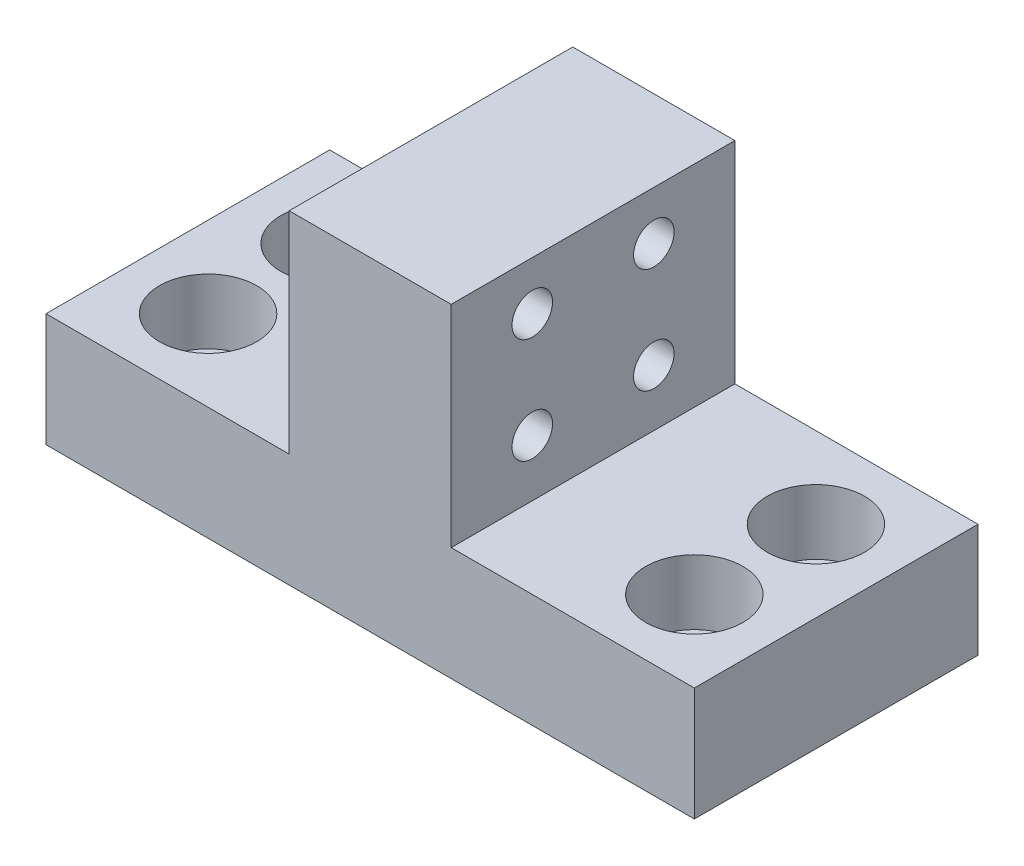
ISO-10303-21;
HEADER;
FILE_DESCRIPTION(('STEP AP214'),'2;1');
FILE_NAME('part.step','',(''),(''),'','','');
FILE_SCHEMA(('AUTOMOTIVE_DESIGN { 1 0 10303 214 1 1 1 1 }'));
ENDSEC;
DATA;
#1=APPLICATION_CONTEXT('core data for automotive mechanical design processes');
#2=APPLICATION_PROTOCOL_DEFINITION('international standard','automotive_design',2000,#1);
#3=PRODUCT_CONTEXT('',#1,'mechanical');
#4=PRODUCT('Part','Part','',(#3));
#5=PRODUCT_RELATED_PRODUCT_CATEGORY('part','',(#4));
#6=PRODUCT_DEFINITION_FORMATION('','',#4);
#7=PRODUCT_DEFINITION_CONTEXT('part definition',#1,'design');
#8=PRODUCT_DEFINITION('design','',#6,#7);
#9=PRODUCT_DEFINITION_SHAPE('','',#8);
#10=(LENGTH_UNIT() NAMED_UNIT(*) SI_UNIT(.MILLI.,.METRE.));
#11=(NAMED_UNIT(*) PLANE_ANGLE_UNIT() SI_UNIT($,.RADIAN.));
#12=(NAMED_UNIT(*) SI_UNIT($,.STERADIAN.) SOLID_ANGLE_UNIT());
#13=UNCERTAINTY_MEASURE_WITH_UNIT(LENGTH_MEASURE(1.E-05),#10,'distance_accuracy_value','');
#14=(GEOMETRIC_REPRESENTATION_CONTEXT(3) GLOBAL_UNCERTAINTY_ASSIGNED_CONTEXT((#13)) GLOBAL_UNIT_ASSIGNED_CONTEXT((#10,
#11,#12)) REPRESENTATION_CONTEXT('',''));
#15=CARTESIAN_POINT('',(0.,0.,0.));
#16=DIRECTION('',(0.,0.,1.));
#17=DIRECTION('',(1.,0.,0.));
#18=AXIS2_PLACEMENT_3D('',#15,#16,#17);
#19=CARTESIAN_POINT('',(40.,34.,7.5));
#20=DIRECTION('',(-1.,0.,0.));
#21=DIRECTION('',(0.,0.,1.));
#22=AXIS2_PLACEMENT_3D('',#19,#20,#21);
#23=CYLINDRICAL_SURFACE('',#22,2.5);
#24=CARTESIAN_POINT('',(-10.,34.,7.5));
#25=DIRECTION('',(-1.,0.,0.));
#26=DIRECTION('',(0.,0.,1.));
#27=AXIS2_PLACEMENT_3D('',#24,#25,#26);
#28=CIRCLE('',#27,2.5);
#29=CARTESIAN_POINT('',(-10.,34.,10.));
#30=VERTEX_POINT('',#29);
#31=EDGE_CURVE('E47',#30,#30,#28,.T.);
#32=ORIENTED_EDGE('',*,*,#31,.T.);
#33=EDGE_LOOP('',(#32));
#34=FACE_BOUND('',#33,.T.);
#35=CARTESIAN_POINT('',(10.,34.,7.5));
#36=DIRECTION('',(-1.,0.,0.));
#37=DIRECTION('',(0.,0.,1.));
#38=AXIS2_PLACEMENT_3D('',#35,#36,#37);
#39=CIRCLE('',#38,2.5);
#40=CARTESIAN_POINT('',(10.,34.,10.));
#41=VERTEX_POINT('',#40);
#42=EDGE_CURVE('E11',#41,#41,#39,.T.);
#43=ORIENTED_EDGE('',*,*,#42,.F.);
#44=EDGE_LOOP('',(#43));
#45=FACE_BOUND('',#44,.T.);
#46=ADVANCED_FACE('F39',(#34,#45),#23,.F.);
#47=CARTESIAN_POINT('',(40.,34.,-7.5));
#48=DIRECTION('',(-1.,0.,0.));
#49=DIRECTION('',(0.,0.,1.));
#50=AXIS2_PLACEMENT_3D('',#47,#48,#49);
#51=CYLINDRICAL_SURFACE('',#50,2.5);
#52=CARTESIAN_POINT('',(-10.,34.,-7.5));
#53=DIRECTION('',(-1.,0.,0.));
#54=DIRECTION('',(0.,0.,1.));
#55=AXIS2_PLACEMENT_3D('',#52,#53,#54);
#56=CIRCLE('',#55,2.5);
#57=CARTESIAN_POINT('',(-10.,34.,-5.));
#58=VERTEX_POINT('',#57);
#59=EDGE_CURVE('E181',#58,#58,#56,.T.);
#60=ORIENTED_EDGE('',*,*,#59,.T.);
#61=EDGE_LOOP('',(#60));
#62=FACE_BOUND('',#61,.T.);
#63=CARTESIAN_POINT('',(10.,34.,-7.5));
#64=DIRECTION('',(-1.,0.,0.));
#65=DIRECTION('',(0.,0.,1.));
#66=AXIS2_PLACEMENT_3D('',#63,#64,#65);
#67=CIRCLE('',#66,2.5);
#68=CARTESIAN_POINT('',(10.,34.,-5.));
#69=VERTEX_POINT('',#68);
#70=EDGE_CURVE('E191',#69,#69,#67,.T.);
#71=ORIENTED_EDGE('',*,*,#70,.F.);
#72=EDGE_LOOP('',(#71));
#73=FACE_BOUND('',#72,.T.);
#74=ADVANCED_FACE('F218',(#62,#73),#51,.F.);
#75=CARTESIAN_POINT('',(0.,14.,0.));
#76=DIRECTION('',(0.,1.,0.));
#77=DIRECTION('',(0.,0.,1.));
#78=AXIS2_PLACEMENT_3D('',#75,#76,#77);
#79=PLANE('',#78);
#80=CARTESIAN_POINT('',(30.,14.,7.5));
#81=DIRECTION('',(0.,1.,0.));
#82=DIRECTION('',(0.,0.,1.));
#83=AXIS2_PLACEMENT_3D('',#80,#81,#82);
#84=CIRCLE('',#83,6.);
#85=CARTESIAN_POINT('',(30.,14.,13.5));
#86=VERTEX_POINT('',#85);
#87=EDGE_CURVE('E186',#86,#86,#84,.T.);
#88=ORIENTED_EDGE('',*,*,#87,.F.);
#89=EDGE_LOOP('',(#88));
#90=FACE_BOUND('',#89,.T.);
#91=CARTESIAN_POINT('',(30.,14.,-7.5));
#92=DIRECTION('',(0.,1.,0.));
#93=DIRECTION('',(0.,0.,1.));
#94=AXIS2_PLACEMENT_3D('',#91,#92,#93);
#95=CIRCLE('',#94,6.);
#96=CARTESIAN_POINT('',(30.,14.,-1.5));
#97=VERTEX_POINT('',#96);
#98=EDGE_CURVE('E328',#97,#97,#95,.T.);
#99=ORIENTED_EDGE('',*,*,#98,.F.);
#100=EDGE_LOOP('',(#99));
#101=FACE_BOUND('',#100,.T.);
#102=DIRECTION('',(0.,0.,-1.));
#103=VECTOR('',#102,1.);
#104=CARTESIAN_POINT('',(10.,14.,17.5));
#105=LINE('',#104,#103);
#106=CARTESIAN_POINT('',(10.,14.,17.5));
#107=VERTEX_POINT('',#106);
#108=CARTESIAN_POINT('',(10.,14.,-17.5));
#109=VERTEX_POINT('',#108);
#110=EDGE_CURVE('E54',#107,#109,#105,.T.);
#111=ORIENTED_EDGE('',*,*,#110,.F.);
#112=DIRECTION('',(1.,0.,0.));
#113=VECTOR('',#112,1.);
#114=CARTESIAN_POINT('',(-40.,14.,17.5));
#115=LINE('',#114,#113);
#116=CARTESIAN_POINT('',(40.,14.,17.5));
#117=VERTEX_POINT('',#116);
#118=EDGE_CURVE('E150',#107,#117,#115,.T.);
#119=ORIENTED_EDGE('',*,*,#118,.T.);
#120=DIRECTION('',(0.,0.,-1.));
#121=VECTOR('',#120,1.);
#122=CARTESIAN_POINT('',(40.,14.,17.5));
#123=LINE('',#122,#121);
#124=CARTESIAN_POINT('',(40.,14.,-17.5));
#125=VERTEX_POINT('',#124);
#126=EDGE_CURVE('E154',#117,#125,#123,.T.);
#127=ORIENTED_EDGE('',*,*,#126,.T.);
#128=DIRECTION('',(-1.,0.,0.));
#129=VECTOR('',#128,1.);
#130=CARTESIAN_POINT('',(40.,14.,-17.5));
#131=LINE('',#130,#129);
#132=EDGE_CURVE('E144',#125,#109,#131,.T.);
#133=ORIENTED_EDGE('',*,*,#132,.T.);
#134=EDGE_LOOP('',(#111,#119,#127,#133));
#135=FACE_BOUND('',#134,.T.);
#136=ADVANCED_FACE('F222',(#90,#101,#135),#79,.T.);
#137=CARTESIAN_POINT('',(40.,14.,-17.5));
#138=DIRECTION('',(0.,0.,1.));
#139=DIRECTION('',(1.,0.,0.));
#140=AXIS2_PLACEMENT_3D('',#137,#138,#139);
#141=PLANE('',#140);
#142=DIRECTION('',(-1.,0.,0.));
#143=VECTOR('',#142,1.);
#144=CARTESIAN_POINT('',(40.,0.,-17.5));
#145=LINE('',#144,#143);
#146=CARTESIAN_POINT('',(40.,0.,-17.5));
#147=VERTEX_POINT('',#146);
#148=CARTESIAN_POINT('',(-40.,0.,-17.5));
#149=VERTEX_POINT('',#148);
#150=EDGE_CURVE('E132',#147,#149,#145,.T.);
#151=ORIENTED_EDGE('',*,*,#150,.T.);
#152=DIRECTION('',(0.,-1.,0.));
#153=VECTOR('',#152,1.);
#154=CARTESIAN_POINT('',(-40.,14.,-17.5));
#155=LINE('',#154,#153);
#156=CARTESIAN_POINT('',(-40.,14.,-17.5));
#157=VERTEX_POINT('',#156);
#158=EDGE_CURVE('E177',#157,#149,#155,.T.);
#159=ORIENTED_EDGE('',*,*,#158,.F.);
#160=CARTESIAN_POINT('',(-10.,14.,-17.5));
#161=VERTEX_POINT('',#160);
#162=EDGE_CURVE('E130',#161,#157,#131,.T.);
#163=ORIENTED_EDGE('',*,*,#162,.F.);
#164=DIRECTION('',(0.,-1.,0.));
#165=VECTOR('',#164,1.);
#166=CARTESIAN_POINT('',(-10.,40.,-17.5));
#167=LINE('',#166,#165);
#168=CARTESIAN_POINT('',(-10.,40.,-17.5));
#169=VERTEX_POINT('',#168);
#170=EDGE_CURVE('E109',#169,#161,#167,.T.);
#171=ORIENTED_EDGE('',*,*,#170,.F.);
#172=DIRECTION('',(-1.,0.,0.));
#173=VECTOR('',#172,1.);
#174=CARTESIAN_POINT('',(10.,40.,-17.5));
#175=LINE('',#174,#173);
#176=CARTESIAN_POINT('',(10.,40.,-17.5));
#177=VERTEX_POINT('',#176);
#178=EDGE_CURVE('E116',#177,#169,#175,.T.);
#179=ORIENTED_EDGE('',*,*,#178,.F.);
#180=DIRECTION('',(0.,-1.,0.));
#181=VECTOR('',#180,1.);
#182=CARTESIAN_POINT('',(10.,40.,-17.5));
#183=LINE('',#182,#181);
#184=EDGE_CURVE('E281',#177,#109,#183,.T.);
#185=ORIENTED_EDGE('',*,*,#184,.T.);
#186=ORIENTED_EDGE('',*,*,#132,.F.);
#187=DIRECTION('',(0.,-1.,0.));
#188=VECTOR('',#187,1.);
#189=CARTESIAN_POINT('',(40.,14.,-17.5));
#190=LINE('',#189,#188);
#191=EDGE_CURVE('E156',#125,#147,#190,.T.);
#192=ORIENTED_EDGE('',*,*,#191,.T.);
#193=EDGE_LOOP('',(#151,#159,#163,#171,#179,#185,#186,#192));
#194=FACE_BOUND('',#193,.T.);
#195=ADVANCED_FACE('F128',(#194),#141,.F.);
#196=CARTESIAN_POINT('',(-40.,14.,-17.5));
#197=DIRECTION('',(1.,0.,0.));
#198=DIRECTION('',(0.,0.,-1.));
#199=AXIS2_PLACEMENT_3D('',#196,#197,#198);
#200=PLANE('',#199);
#201=DIRECTION('',(0.,0.,1.));
#202=VECTOR('',#201,1.);
#203=CARTESIAN_POINT('',(-40.,0.,-17.5));
#204=LINE('',#203,#202);
#205=CARTESIAN_POINT('',(-40.,0.,17.5));
#206=VERTEX_POINT('',#205);
#207=EDGE_CURVE('E137',#149,#206,#204,.T.);
#208=ORIENTED_EDGE('',*,*,#207,.T.);
#209=DIRECTION('',(0.,-1.,0.));
#210=VECTOR('',#209,1.);
#211=CARTESIAN_POINT('',(-40.,14.,17.5));
#212=LINE('',#211,#210);
#213=CARTESIAN_POINT('',(-40.,14.,17.5));
#214=VERTEX_POINT('',#213);
#215=EDGE_CURVE('E173',#214,#206,#212,.T.);
#216=ORIENTED_EDGE('',*,*,#215,.F.);
#217=DIRECTION('',(0.,0.,1.));
#218=VECTOR('',#217,1.);
#219=CARTESIAN_POINT('',(-40.,14.,-17.5));
#220=LINE('',#219,#218);
#221=EDGE_CURVE('E147',#157,#214,#220,.T.);
#222=ORIENTED_EDGE('',*,*,#221,.F.);
#223=ORIENTED_EDGE('',*,*,#158,.T.);
#224=EDGE_LOOP('',(#208,#216,#222,#223));
#225=FACE_BOUND('',#224,.T.);
#226=ADVANCED_FACE('F232',(#225),#200,.F.);
#227=CARTESIAN_POINT('',(-40.,14.,17.5));
#228=DIRECTION('',(0.,0.,-1.));
#229=DIRECTION('',(-1.,0.,0.));
#230=AXIS2_PLACEMENT_3D('',#227,#228,#229);
#231=PLANE('',#230);
#232=DIRECTION('',(1.,0.,0.));
#233=VECTOR('',#232,1.);
#234=CARTESIAN_POINT('',(-40.,0.,17.5));
#235=LINE('',#234,#233);
#236=CARTESIAN_POINT('',(40.,0.,17.5));
#237=VERTEX_POINT('',#236);
#238=EDGE_CURVE('E160',#206,#237,#235,.T.);
#239=ORIENTED_EDGE('',*,*,#238,.T.);
#240=DIRECTION('',(0.,-1.,0.));
#241=VECTOR('',#240,1.);
#242=CARTESIAN_POINT('',(40.,14.,17.5));
#243=LINE('',#242,#241);
#244=EDGE_CURVE('E169',#117,#237,#243,.T.);
#245=ORIENTED_EDGE('',*,*,#244,.F.);
#246=ORIENTED_EDGE('',*,*,#118,.F.);
#247=DIRECTION('',(0.,-1.,0.));
#248=VECTOR('',#247,1.);
#249=CARTESIAN_POINT('',(10.,40.,17.5));
#250=LINE('',#249,#248);
#251=CARTESIAN_POINT('',(10.,40.,17.5));
#252=VERTEX_POINT('',#251);
#253=EDGE_CURVE('E140',#252,#107,#250,.T.);
#254=ORIENTED_EDGE('',*,*,#253,.F.);
#255=DIRECTION('',(1.,0.,0.));
#256=VECTOR('',#255,1.);
#257=CARTESIAN_POINT('',(10.,40.,17.5));
#258=LINE('',#257,#256);
#259=CARTESIAN_POINT('',(-10.,40.,17.5));
#260=VERTEX_POINT('',#259);
#261=EDGE_CURVE('E115',#260,#252,#258,.T.);
#262=ORIENTED_EDGE('',*,*,#261,.F.);
#263=DIRECTION('',(0.,-1.,0.));
#264=VECTOR('',#263,1.);
#265=CARTESIAN_POINT('',(-10.,40.,17.5));
#266=LINE('',#265,#264);
#267=CARTESIAN_POINT('',(-10.,14.,17.5));
#268=VERTEX_POINT('',#267);
#269=EDGE_CURVE('E111',#260,#268,#266,.T.);
#270=ORIENTED_EDGE('',*,*,#269,.T.);
#271=EDGE_CURVE('E151',#214,#268,#115,.T.);
#272=ORIENTED_EDGE('',*,*,#271,.F.);
#273=ORIENTED_EDGE('',*,*,#215,.T.);
#274=EDGE_LOOP('',(#239,#245,#246,#254,#262,#270,#272,#273));
#275=FACE_BOUND('',#274,.T.);
#276=ADVANCED_FACE('F235',(#275),#231,.F.);
#277=CARTESIAN_POINT('',(40.,14.,17.5));
#278=DIRECTION('',(-1.,0.,0.));
#279=DIRECTION('',(0.,0.,1.));
#280=AXIS2_PLACEMENT_3D('',#277,#278,#279);
#281=PLANE('',#280);
#282=DIRECTION('',(0.,0.,-1.));
#283=VECTOR('',#282,1.);
#284=CARTESIAN_POINT('',(40.,0.,17.5));
#285=LINE('',#284,#283);
#286=EDGE_CURVE('E163',#237,#147,#285,.T.);
#287=ORIENTED_EDGE('',*,*,#286,.T.);
#288=ORIENTED_EDGE('',*,*,#191,.F.);
#289=ORIENTED_EDGE('',*,*,#126,.F.);
#290=ORIENTED_EDGE('',*,*,#244,.T.);
#291=EDGE_LOOP('',(#287,#288,#289,#290));
#292=FACE_BOUND('',#291,.T.);
#293=ADVANCED_FACE('F239',(#292),#281,.F.);
#294=CARTESIAN_POINT('',(-30.,14.,7.5));
#295=DIRECTION('',(0.,1.,0.));
#296=DIRECTION('',(0.,0.,1.));
#297=AXIS2_PLACEMENT_3D('',#294,#295,#296);
#298=CIRCLE('',#297,6.);
#299=CARTESIAN_POINT('',(-30.,14.,13.5));
#300=VERTEX_POINT('',#299);
#301=EDGE_CURVE('E250',#300,#300,#298,.T.);
#302=ORIENTED_EDGE('',*,*,#301,.F.);
#303=EDGE_LOOP('',(#302));
#304=FACE_BOUND('',#303,.T.);
#305=CARTESIAN_POINT('',(-30.,14.,-7.5));
#306=DIRECTION('',(0.,1.,0.));
#307=DIRECTION('',(0.,0.,1.));
#308=AXIS2_PLACEMENT_3D('',#305,#306,#307);
#309=CIRCLE('',#308,6.);
#310=CARTESIAN_POINT('',(-30.,14.,-1.5));
#311=VERTEX_POINT('',#310);
#312=EDGE_CURVE('E253',#311,#311,#309,.T.);
#313=ORIENTED_EDGE('',*,*,#312,.F.);
#314=EDGE_LOOP('',(#313));
#315=FACE_BOUND('',#314,.T.);
#316=DIRECTION('',(0.,0.,1.));
#317=VECTOR('',#316,1.);
#318=CARTESIAN_POINT('',(-10.,14.,-17.5));
#319=LINE('',#318,#317);
#320=EDGE_CURVE('E62',#161,#268,#319,.T.);
#321=ORIENTED_EDGE('',*,*,#320,.F.);
#322=ORIENTED_EDGE('',*,*,#162,.T.);
#323=ORIENTED_EDGE('',*,*,#221,.T.);
#324=ORIENTED_EDGE('',*,*,#271,.T.);
#325=EDGE_LOOP('',(#321,#322,#323,#324));
#326=FACE_BOUND('',#325,.T.);
#327=ADVANCED_FACE('F211',(#304,#315,#326),#79,.T.);
#328=CARTESIAN_POINT('',(0.,0.,0.));
#329=DIRECTION('',(0.,1.,0.));
#330=DIRECTION('',(0.,0.,1.));
#331=AXIS2_PLACEMENT_3D('',#328,#329,#330);
#332=PLANE('',#331);
#333=CARTESIAN_POINT('',(30.,0.,7.5));
#334=DIRECTION('',(0.,1.,0.));
#335=DIRECTION('',(0.,0.,1.));
#336=AXIS2_PLACEMENT_3D('',#333,#334,#335);
#337=CIRCLE('',#336,3.5);
#338=CARTESIAN_POINT('',(30.,0.,11.));
#339=VERTEX_POINT('',#338);
#340=EDGE_CURVE('E300',#339,#339,#337,.T.);
#341=ORIENTED_EDGE('',*,*,#340,.T.);
#342=EDGE_LOOP('',(#341));
#343=FACE_BOUND('',#342,.T.);
#344=CARTESIAN_POINT('',(30.,0.,-7.5));
#345=DIRECTION('',(0.,1.,0.));
#346=DIRECTION('',(0.,0.,1.));
#347=AXIS2_PLACEMENT_3D('',#344,#345,#346);
#348=CIRCLE('',#347,3.5);
#349=CARTESIAN_POINT('',(30.,0.,-4.));
#350=VERTEX_POINT('',#349);
#351=EDGE_CURVE('E316',#350,#350,#348,.T.);
#352=ORIENTED_EDGE('',*,*,#351,.T.);
#353=EDGE_LOOP('',(#352));
#354=FACE_BOUND('',#353,.T.);
#355=CARTESIAN_POINT('',(-30.,0.,7.5));
#356=DIRECTION('',(0.,1.,0.));
#357=DIRECTION('',(0.,0.,1.));
#358=AXIS2_PLACEMENT_3D('',#355,#356,#357);
#359=CIRCLE('',#358,3.5);
#360=CARTESIAN_POINT('',(-30.,0.,11.));
#361=VERTEX_POINT('',#360);
#362=EDGE_CURVE('E257',#361,#361,#359,.T.);
#363=ORIENTED_EDGE('',*,*,#362,.T.);
#364=EDGE_LOOP('',(#363));
#365=FACE_BOUND('',#364,.T.);
#366=CARTESIAN_POINT('',(-30.,0.,-7.5));
#367=DIRECTION('',(0.,1.,0.));
#368=DIRECTION('',(0.,0.,1.));
#369=AXIS2_PLACEMENT_3D('',#366,#367,#368);
#370=CIRCLE('',#369,3.5);
#371=CARTESIAN_POINT('',(-30.,0.,-4.));
#372=VERTEX_POINT('',#371);
#373=EDGE_CURVE('E273',#372,#372,#370,.T.);
#374=ORIENTED_EDGE('',*,*,#373,.T.);
#375=EDGE_LOOP('',(#374));
#376=FACE_BOUND('',#375,.T.);
#377=ORIENTED_EDGE('',*,*,#150,.F.);
#378=ORIENTED_EDGE('',*,*,#286,.F.);
#379=ORIENTED_EDGE('',*,*,#238,.F.);
#380=ORIENTED_EDGE('',*,*,#207,.F.);
#381=EDGE_LOOP('',(#377,#378,#379,#380));
#382=FACE_BOUND('',#381,.T.);
#383=ADVANCED_FACE('F202',(#343,#354,#365,#376,#382),#332,.F.);
#384=CARTESIAN_POINT('',(-10.,40.,-17.5));
#385=DIRECTION('',(1.,0.,0.));
#386=DIRECTION('',(0.,0.,-1.));
#387=AXIS2_PLACEMENT_3D('',#384,#385,#386);
#388=PLANE('',#387);
#389=CARTESIAN_POINT('',(-10.,21.,7.5));
#390=DIRECTION('',(-1.,0.,0.));
#391=DIRECTION('',(0.,0.,1.));
#392=AXIS2_PLACEMENT_3D('',#389,#390,#391);
#393=CIRCLE('',#392,2.5);
#394=CARTESIAN_POINT('',(-10.,21.,10.));
#395=VERTEX_POINT('',#394);
#396=EDGE_CURVE('E342',#395,#395,#393,.T.);
#397=ORIENTED_EDGE('',*,*,#396,.F.);
#398=EDGE_LOOP('',(#397));
#399=FACE_BOUND('',#398,.T.);
#400=CARTESIAN_POINT('',(-10.,21.,-7.5));
#401=DIRECTION('',(-1.,0.,0.));
#402=DIRECTION('',(0.,0.,1.));
#403=AXIS2_PLACEMENT_3D('',#400,#401,#402);
#404=CIRCLE('',#403,2.5);
#405=CARTESIAN_POINT('',(-10.,21.,-5.));
#406=VERTEX_POINT('',#405);
#407=EDGE_CURVE('E187',#406,#406,#404,.T.);
#408=ORIENTED_EDGE('',*,*,#407,.F.);
#409=EDGE_LOOP('',(#408));
#410=FACE_BOUND('',#409,.T.);
#411=ORIENTED_EDGE('',*,*,#320,.T.);
#412=ORIENTED_EDGE('',*,*,#269,.F.);
#413=DIRECTION('',(0.,0.,1.));
#414=VECTOR('',#413,1.);
#415=CARTESIAN_POINT('',(-10.,40.,-17.5));
#416=LINE('',#415,#414);
#417=EDGE_CURVE('E104',#169,#260,#416,.T.);
#418=ORIENTED_EDGE('',*,*,#417,.F.);
#419=ORIENTED_EDGE('',*,*,#170,.T.);
#420=EDGE_LOOP('',(#411,#412,#418,#419));
#421=FACE_BOUND('',#420,.T.);
#422=ORIENTED_EDGE('',*,*,#59,.F.);
#423=EDGE_LOOP('',(#422));
#424=FACE_BOUND('',#423,.T.);
#425=ORIENTED_EDGE('',*,*,#31,.F.);
#426=EDGE_LOOP('',(#425));
#427=FACE_BOUND('',#426,.T.);
#428=ADVANCED_FACE('F106',(#399,#410,#421,#424,#427),#388,.F.);
#429=CARTESIAN_POINT('',(10.,40.,17.5));
#430=DIRECTION('',(-1.,0.,0.));
#431=DIRECTION('',(0.,0.,1.));
#432=AXIS2_PLACEMENT_3D('',#429,#430,#431);
#433=PLANE('',#432);
#434=CARTESIAN_POINT('',(10.,21.,7.5));
#435=DIRECTION('',(-1.,0.,0.));
#436=DIRECTION('',(0.,0.,1.));
#437=AXIS2_PLACEMENT_3D('',#434,#435,#436);
#438=CIRCLE('',#437,2.5);
#439=CARTESIAN_POINT('',(10.,21.,10.));
#440=VERTEX_POINT('',#439);
#441=EDGE_CURVE('E304',#440,#440,#438,.T.);
#442=ORIENTED_EDGE('',*,*,#441,.T.);
#443=EDGE_LOOP('',(#442));
#444=FACE_BOUND('',#443,.T.);
#445=CARTESIAN_POINT('',(10.,21.,-7.5));
#446=DIRECTION('',(-1.,0.,0.));
#447=DIRECTION('',(0.,0.,1.));
#448=AXIS2_PLACEMENT_3D('',#445,#446,#447);
#449=CIRCLE('',#448,2.5);
#450=CARTESIAN_POINT('',(10.,21.,-5.));
#451=VERTEX_POINT('',#450);
#452=EDGE_CURVE('E182',#451,#451,#449,.T.);
#453=ORIENTED_EDGE('',*,*,#452,.T.);
#454=EDGE_LOOP('',(#453));
#455=FACE_BOUND('',#454,.T.);
#456=ORIENTED_EDGE('',*,*,#110,.T.);
#457=ORIENTED_EDGE('',*,*,#184,.F.);
#458=DIRECTION('',(0.,0.,-1.));
#459=VECTOR('',#458,1.);
#460=CARTESIAN_POINT('',(10.,40.,17.5));
#461=LINE('',#460,#459);
#462=EDGE_CURVE('E121',#252,#177,#461,.T.);
#463=ORIENTED_EDGE('',*,*,#462,.F.);
#464=ORIENTED_EDGE('',*,*,#253,.T.);
#465=EDGE_LOOP('',(#456,#457,#463,#464));
#466=FACE_BOUND('',#465,.T.);
#467=ORIENTED_EDGE('',*,*,#70,.T.);
#468=EDGE_LOOP('',(#467));
#469=FACE_BOUND('',#468,.T.);
#470=ORIENTED_EDGE('',*,*,#42,.T.);
#471=EDGE_LOOP('',(#470));
#472=FACE_BOUND('',#471,.T.);
#473=ADVANCED_FACE('F201',(#444,#455,#466,#469,#472),#433,.F.);
#474=CARTESIAN_POINT('',(0.,40.,0.));
#475=DIRECTION('',(0.,1.,0.));
#476=DIRECTION('',(0.,0.,1.));
#477=AXIS2_PLACEMENT_3D('',#474,#475,#476);
#478=PLANE('',#477);
#479=ORIENTED_EDGE('',*,*,#178,.T.);
#480=ORIENTED_EDGE('',*,*,#417,.T.);
#481=ORIENTED_EDGE('',*,*,#261,.T.);
#482=ORIENTED_EDGE('',*,*,#462,.T.);
#483=EDGE_LOOP('',(#479,#480,#481,#482));
#484=FACE_BOUND('',#483,.T.);
#485=ADVANCED_FACE('F119',(#484),#478,.T.);
#486=CARTESIAN_POINT('',(-30.,14.,-7.5));
#487=DIRECTION('',(0.,1.,0.));
#488=DIRECTION('',(0.,0.,1.));
#489=AXIS2_PLACEMENT_3D('',#486,#487,#488);
#490=CYLINDRICAL_SURFACE('',#489,3.5);
#491=ORIENTED_EDGE('',*,*,#373,.F.);
#492=EDGE_LOOP('',(#491));
#493=FACE_BOUND('',#492,.T.);
#494=CARTESIAN_POINT('',(-30.,6.,-7.5));
#495=DIRECTION('',(0.,1.,0.));
#496=DIRECTION('',(0.,0.,1.));
#497=AXIS2_PLACEMENT_3D('',#494,#495,#496);
#498=CIRCLE('',#497,3.5);
#499=CARTESIAN_POINT('',(-30.,6.,-4.));
#500=VERTEX_POINT('',#499);
#501=EDGE_CURVE('E262',#500,#500,#498,.T.);
#502=ORIENTED_EDGE('',*,*,#501,.T.);
#503=EDGE_LOOP('',(#502));
#504=FACE_BOUND('',#503,.T.);
#505=ADVANCED_FACE('F403',(#493,#504),#490,.F.);
#506=CARTESIAN_POINT('',(-26.5,6.,-7.5));
#507=DIRECTION('',(0.,-1.,0.));
#508=DIRECTION('',(0.,0.,-1.));
#509=AXIS2_PLACEMENT_3D('',#506,#507,#508);
#510=PLANE('',#509);
#511=ORIENTED_EDGE('',*,*,#501,.F.);
#512=EDGE_LOOP('',(#511));
#513=FACE_BOUND('',#512,.T.);
#514=CARTESIAN_POINT('',(-30.,6.,-7.5));
#515=DIRECTION('',(0.,1.,0.));
#516=DIRECTION('',(0.,0.,1.));
#517=AXIS2_PLACEMENT_3D('',#514,#515,#516);
#518=CIRCLE('',#517,6.);
#519=CARTESIAN_POINT('',(-30.,6.,-1.5));
#520=VERTEX_POINT('',#519);
#521=EDGE_CURVE('E256',#520,#520,#518,.T.);
#522=ORIENTED_EDGE('',*,*,#521,.T.);
#523=EDGE_LOOP('',(#522));
#524=FACE_BOUND('',#523,.T.);
#525=ADVANCED_FACE('F399',(#513,#524),#510,.F.);
#526=CARTESIAN_POINT('',(-30.,14.,-7.5));
#527=DIRECTION('',(0.,1.,0.));
#528=DIRECTION('',(0.,0.,1.));
#529=AXIS2_PLACEMENT_3D('',#526,#527,#528);
#530=CYLINDRICAL_SURFACE('',#529,6.);
#531=ORIENTED_EDGE('',*,*,#521,.F.);
#532=EDGE_LOOP('',(#531));
#533=FACE_BOUND('',#532,.T.);
#534=ORIENTED_EDGE('',*,*,#312,.T.);
#535=EDGE_LOOP('',(#534));
#536=FACE_BOUND('',#535,.T.);
#537=ADVANCED_FACE('F395',(#533,#536),#530,.F.);
#538=CARTESIAN_POINT('',(-30.,14.,7.5));
#539=DIRECTION('',(0.,1.,0.));
#540=DIRECTION('',(0.,0.,1.));
#541=AXIS2_PLACEMENT_3D('',#538,#539,#540);
#542=CYLINDRICAL_SURFACE('',#541,3.5);
#543=ORIENTED_EDGE('',*,*,#362,.F.);
#544=EDGE_LOOP('',(#543));
#545=FACE_BOUND('',#544,.T.);
#546=CARTESIAN_POINT('',(-30.,6.,7.5));
#547=DIRECTION('',(0.,1.,0.));
#548=DIRECTION('',(0.,0.,1.));
#549=AXIS2_PLACEMENT_3D('',#546,#547,#548);
#550=CIRCLE('',#549,3.5);
#551=CARTESIAN_POINT('',(-30.,6.,11.));
#552=VERTEX_POINT('',#551);
#553=EDGE_CURVE('E266',#552,#552,#550,.T.);
#554=ORIENTED_EDGE('',*,*,#553,.T.);
#555=EDGE_LOOP('',(#554));
#556=FACE_BOUND('',#555,.T.);
#557=ADVANCED_FACE('F391',(#545,#556),#542,.F.);
#558=CARTESIAN_POINT('',(-26.5,6.,7.5));
#559=DIRECTION('',(0.,-1.,0.));
#560=DIRECTION('',(0.,0.,-1.));
#561=AXIS2_PLACEMENT_3D('',#558,#559,#560);
#562=PLANE('',#561);
#563=ORIENTED_EDGE('',*,*,#553,.F.);
#564=EDGE_LOOP('',(#563));
#565=FACE_BOUND('',#564,.T.);
#566=CARTESIAN_POINT('',(-30.,6.,7.5));
#567=DIRECTION('',(0.,1.,0.));
#568=DIRECTION('',(0.,0.,1.));
#569=AXIS2_PLACEMENT_3D('',#566,#567,#568);
#570=CIRCLE('',#569,6.);
#571=CARTESIAN_POINT('',(-30.,6.,13.5));
#572=VERTEX_POINT('',#571);
#573=EDGE_CURVE('E307',#572,#572,#570,.T.);
#574=ORIENTED_EDGE('',*,*,#573,.T.);
#575=EDGE_LOOP('',(#574));
#576=FACE_BOUND('',#575,.T.);
#577=ADVANCED_FACE('F387',(#565,#576),#562,.F.);
#578=CARTESIAN_POINT('',(-30.,14.,7.5));
#579=DIRECTION('',(0.,1.,0.));
#580=DIRECTION('',(0.,0.,1.));
#581=AXIS2_PLACEMENT_3D('',#578,#579,#580);
#582=CYLINDRICAL_SURFACE('',#581,6.);
#583=ORIENTED_EDGE('',*,*,#573,.F.);
#584=EDGE_LOOP('',(#583));
#585=FACE_BOUND('',#584,.T.);
#586=ORIENTED_EDGE('',*,*,#301,.T.);
#587=EDGE_LOOP('',(#586));
#588=FACE_BOUND('',#587,.T.);
#589=ADVANCED_FACE('F383',(#585,#588),#582,.F.);
#590=CARTESIAN_POINT('',(30.,14.,-7.5));
#591=DIRECTION('',(0.,1.,0.));
#592=DIRECTION('',(0.,0.,1.));
#593=AXIS2_PLACEMENT_3D('',#590,#591,#592);
#594=CYLINDRICAL_SURFACE('',#593,3.5);
#595=ORIENTED_EDGE('',*,*,#351,.F.);
#596=EDGE_LOOP('',(#595));
#597=FACE_BOUND('',#596,.T.);
#598=CARTESIAN_POINT('',(30.,6.,-7.5));
#599=DIRECTION('',(0.,1.,0.));
#600=DIRECTION('',(0.,0.,1.));
#601=AXIS2_PLACEMENT_3D('',#598,#599,#600);
#602=CIRCLE('',#601,3.5);
#603=CARTESIAN_POINT('',(30.,6.,-4.));
#604=VERTEX_POINT('',#603);
#605=EDGE_CURVE('E320',#604,#604,#602,.T.);
#606=ORIENTED_EDGE('',*,*,#605,.T.);
#607=EDGE_LOOP('',(#606));
#608=FACE_BOUND('',#607,.T.);
#609=ADVANCED_FACE('F379',(#597,#608),#594,.F.);
#610=CARTESIAN_POINT('',(33.5,6.,-7.5));
#611=DIRECTION('',(0.,-1.,0.));
#612=DIRECTION('',(0.,0.,-1.));
#613=AXIS2_PLACEMENT_3D('',#610,#611,#612);
#614=PLANE('',#613);
#615=ORIENTED_EDGE('',*,*,#605,.F.);
#616=EDGE_LOOP('',(#615));
#617=FACE_BOUND('',#616,.T.);
#618=CARTESIAN_POINT('',(30.,6.,-7.5));
#619=DIRECTION('',(0.,1.,0.));
#620=DIRECTION('',(0.,0.,1.));
#621=AXIS2_PLACEMENT_3D('',#618,#619,#620);
#622=CIRCLE('',#621,6.);
#623=CARTESIAN_POINT('',(30.,6.,-1.5));
#624=VERTEX_POINT('',#623);
#625=EDGE_CURVE('E324',#624,#624,#622,.T.);
#626=ORIENTED_EDGE('',*,*,#625,.T.);
#627=EDGE_LOOP('',(#626));
#628=FACE_BOUND('',#627,.T.);
#629=ADVANCED_FACE('F375',(#617,#628),#614,.F.);
#630=CARTESIAN_POINT('',(30.,14.,-7.5));
#631=DIRECTION('',(0.,1.,0.));
#632=DIRECTION('',(0.,0.,1.));
#633=AXIS2_PLACEMENT_3D('',#630,#631,#632);
#634=CYLINDRICAL_SURFACE('',#633,6.);
#635=ORIENTED_EDGE('',*,*,#625,.F.);
#636=EDGE_LOOP('',(#635));
#637=FACE_BOUND('',#636,.T.);
#638=ORIENTED_EDGE('',*,*,#98,.T.);
#639=EDGE_LOOP('',(#638));
#640=FACE_BOUND('',#639,.T.);
#641=ADVANCED_FACE('F371',(#637,#640),#634,.F.);
#642=CARTESIAN_POINT('',(30.,14.,7.5));
#643=DIRECTION('',(0.,1.,0.));
#644=DIRECTION('',(0.,0.,1.));
#645=AXIS2_PLACEMENT_3D('',#642,#643,#644);
#646=CYLINDRICAL_SURFACE('',#645,3.5);
#647=ORIENTED_EDGE('',*,*,#340,.F.);
#648=EDGE_LOOP('',(#647));
#649=FACE_BOUND('',#648,.T.);
#650=CARTESIAN_POINT('',(30.,6.,7.5));
#651=DIRECTION('',(0.,1.,0.));
#652=DIRECTION('',(0.,0.,1.));
#653=AXIS2_PLACEMENT_3D('',#650,#651,#652);
#654=CIRCLE('',#653,3.5);
#655=CARTESIAN_POINT('',(30.,6.,11.));
#656=VERTEX_POINT('',#655);
#657=EDGE_CURVE('E297',#656,#656,#654,.T.);
#658=ORIENTED_EDGE('',*,*,#657,.T.);
#659=EDGE_LOOP('',(#658));
#660=FACE_BOUND('',#659,.T.);
#661=ADVANCED_FACE('F367',(#649,#660),#646,.F.);
#662=CARTESIAN_POINT('',(33.5,6.,7.5));
#663=DIRECTION('',(0.,-1.,0.));
#664=DIRECTION('',(0.,0.,-1.));
#665=AXIS2_PLACEMENT_3D('',#662,#663,#664);
#666=PLANE('',#665);
#667=ORIENTED_EDGE('',*,*,#657,.F.);
#668=EDGE_LOOP('',(#667));
#669=FACE_BOUND('',#668,.T.);
#670=CARTESIAN_POINT('',(30.,6.,7.5));
#671=DIRECTION('',(0.,1.,0.));
#672=DIRECTION('',(0.,0.,1.));
#673=AXIS2_PLACEMENT_3D('',#670,#671,#672);
#674=CIRCLE('',#673,6.);
#675=CARTESIAN_POINT('',(30.,6.,13.5));
#676=VERTEX_POINT('',#675);
#677=EDGE_CURVE('E301',#676,#676,#674,.T.);
#678=ORIENTED_EDGE('',*,*,#677,.T.);
#679=EDGE_LOOP('',(#678));
#680=FACE_BOUND('',#679,.T.);
#681=ADVANCED_FACE('F361',(#669,#680),#666,.F.);
#682=CARTESIAN_POINT('',(30.,14.,7.5));
#683=DIRECTION('',(0.,1.,0.));
#684=DIRECTION('',(0.,0.,1.));
#685=AXIS2_PLACEMENT_3D('',#682,#683,#684);
#686=CYLINDRICAL_SURFACE('',#685,6.);
#687=ORIENTED_EDGE('',*,*,#677,.F.);
#688=EDGE_LOOP('',(#687));
#689=FACE_BOUND('',#688,.T.);
#690=ORIENTED_EDGE('',*,*,#87,.T.);
#691=EDGE_LOOP('',(#690));
#692=FACE_BOUND('',#691,.T.);
#693=ADVANCED_FACE('F355',(#689,#692),#686,.F.);
#694=CARTESIAN_POINT('',(40.,21.,-7.5));
#695=DIRECTION('',(-1.,0.,0.));
#696=DIRECTION('',(0.,0.,1.));
#697=AXIS2_PLACEMENT_3D('',#694,#695,#696);
#698=CYLINDRICAL_SURFACE('',#697,2.5);
#699=ORIENTED_EDGE('',*,*,#407,.T.);
#700=EDGE_LOOP('',(#699));
#701=FACE_BOUND('',#700,.T.);
#702=ORIENTED_EDGE('',*,*,#452,.F.);
#703=EDGE_LOOP('',(#702));
#704=FACE_BOUND('',#703,.T.);
#705=ADVANCED_FACE('F348',(#701,#704),#698,.F.);
#706=CARTESIAN_POINT('',(40.,21.,7.5));
#707=DIRECTION('',(-1.,0.,0.));
#708=DIRECTION('',(0.,0.,1.));
#709=AXIS2_PLACEMENT_3D('',#706,#707,#708);
#710=CYLINDRICAL_SURFACE('',#709,2.5);
#711=ORIENTED_EDGE('',*,*,#396,.T.);
#712=EDGE_LOOP('',(#711));
#713=FACE_BOUND('',#712,.T.);
#714=ORIENTED_EDGE('',*,*,#441,.F.);
#715=EDGE_LOOP('',(#714));
#716=FACE_BOUND('',#715,.T.);
#717=ADVANCED_FACE('F345',(#713,#716),#710,.F.);
#718=CLOSED_SHELL('',(#46,#74,#136,#195,#226,#276,#293,#327,#383,#428,#473,#485,#505,#525,#537,
#557,#577,#589,#609,#629,#641,#661,#681,#693,#705,#717));
#719=MANIFOLD_SOLID_BREP('B2',#718);
#720=ADVANCED_BREP_SHAPE_REPRESENTATION('',(#18,#719),#14);
#721=SHAPE_DEFINITION_REPRESENTATION(#9,#720);
ENDSEC;
END-ISO-10303-21;
